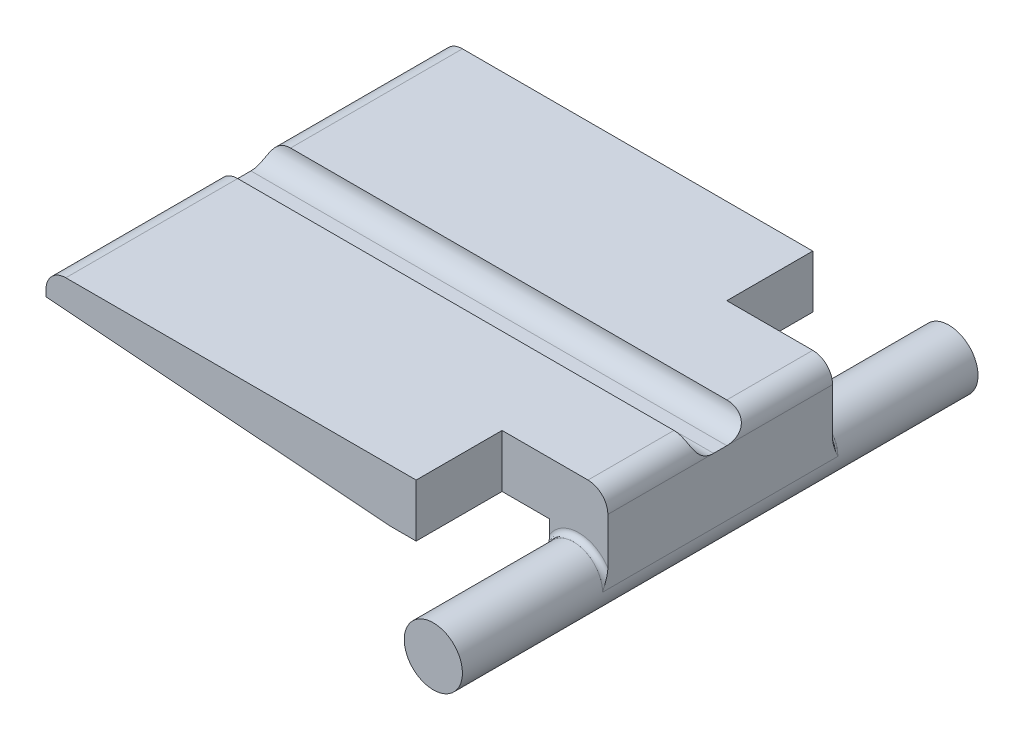
ISO-10303-21;
HEADER;
FILE_DESCRIPTION(('STEP AP214'),'2;1');
FILE_NAME('part.step','',(''),(''),'','','');
FILE_SCHEMA(('AUTOMOTIVE_DESIGN { 1 0 10303 214 1 1 1 1 }'));
ENDSEC;
DATA;
#1=APPLICATION_CONTEXT('core data for automotive mechanical design processes');
#2=APPLICATION_PROTOCOL_DEFINITION('international standard','automotive_design',2000,#1);
#3=PRODUCT_CONTEXT('',#1,'mechanical');
#4=PRODUCT('Part','Part','',(#3));
#5=PRODUCT_RELATED_PRODUCT_CATEGORY('part','',(#4));
#6=PRODUCT_DEFINITION_FORMATION('','',#4);
#7=PRODUCT_DEFINITION_CONTEXT('part definition',#1,'design');
#8=PRODUCT_DEFINITION('design','',#6,#7);
#9=PRODUCT_DEFINITION_SHAPE('','',#8);
#10=(LENGTH_UNIT() NAMED_UNIT(*) SI_UNIT(.MILLI.,.METRE.));
#11=(NAMED_UNIT(*) PLANE_ANGLE_UNIT() SI_UNIT($,.RADIAN.));
#12=(NAMED_UNIT(*) SI_UNIT($,.STERADIAN.) SOLID_ANGLE_UNIT());
#13=UNCERTAINTY_MEASURE_WITH_UNIT(LENGTH_MEASURE(1.E-05),#10,'distance_accuracy_value','');
#14=(GEOMETRIC_REPRESENTATION_CONTEXT(3) GLOBAL_UNCERTAINTY_ASSIGNED_CONTEXT((#13)) GLOBAL_UNIT_ASSIGNED_CONTEXT((#10,
#11,#12)) REPRESENTATION_CONTEXT('',''));
#15=CARTESIAN_POINT('',(0.,0.,0.));
#16=DIRECTION('',(0.,0.,1.));
#17=DIRECTION('',(1.,0.,0.));
#18=AXIS2_PLACEMENT_3D('',#15,#16,#17);
#19=CARTESIAN_POINT('',(0.,2.,0.));
#20=DIRECTION('',(0.,-1.,0.));
#21=DIRECTION('',(0.,0.,-1.));
#22=AXIS2_PLACEMENT_3D('',#19,#20,#21);
#23=PLANE('',#22);
#24=DIRECTION('',(-1.,0.,0.));
#25=VECTOR('',#24,1.);
#26=CARTESIAN_POINT('',(0.,2.,1.));
#27=LINE('',#26,#25);
#28=CARTESIAN_POINT('',(10.25,2.,1.));
#29=VERTEX_POINT('',#28);
#30=CARTESIAN_POINT('',(-6.25,2.,1.));
#31=VERTEX_POINT('',#30);
#32=EDGE_CURVE('E291',#29,#31,#27,.T.);
#33=ORIENTED_EDGE('',*,*,#32,.T.);
#34=DIRECTION('',(0.,0.,1.));
#35=VECTOR('',#34,1.);
#36=CARTESIAN_POINT('',(-6.25,2.,0.));
#37=LINE('',#36,#35);
#38=CARTESIAN_POINT('',(-6.25,2.,7.5));
#39=VERTEX_POINT('',#38);
#40=EDGE_CURVE('E427',#31,#39,#37,.T.);
#41=ORIENTED_EDGE('',*,*,#40,.T.);
#42=DIRECTION('',(1.,0.,0.));
#43=VECTOR('',#42,1.);
#44=CARTESIAN_POINT('',(-7.,2.,7.5));
#45=LINE('',#44,#43);
#46=CARTESIAN_POINT('',(7.,2.,7.5));
#47=VERTEX_POINT('',#46);
#48=EDGE_CURVE('E230',#39,#47,#45,.T.);
#49=ORIENTED_EDGE('',*,*,#48,.T.);
#50=DIRECTION('',(0.,0.,-1.));
#51=VECTOR('',#50,1.);
#52=CARTESIAN_POINT('',(7.,2.,7.5));
#53=LINE('',#52,#51);
#54=CARTESIAN_POINT('',(7.,2.,4.25));
#55=VERTEX_POINT('',#54);
#56=EDGE_CURVE('E233',#47,#55,#53,.T.);
#57=ORIENTED_EDGE('',*,*,#56,.T.);
#58=DIRECTION('',(1.,0.,0.));
#59=VECTOR('',#58,1.);
#60=CARTESIAN_POINT('',(7.,2.,4.25));
#61=LINE('',#60,#59);
#62=CARTESIAN_POINT('',(10.25,2.,4.25));
#63=VERTEX_POINT('',#62);
#64=EDGE_CURVE('E236',#55,#63,#61,.T.);
#65=ORIENTED_EDGE('',*,*,#64,.T.);
#66=DIRECTION('',(0.,0.,-1.));
#67=VECTOR('',#66,1.);
#68=CARTESIAN_POINT('',(10.25,2.,0.));
#69=LINE('',#68,#67);
#70=EDGE_CURVE('E423',#63,#29,#69,.T.);
#71=ORIENTED_EDGE('',*,*,#70,.T.);
#72=EDGE_LOOP('',(#33,#41,#49,#57,#65,#71));
#73=FACE_BOUND('',#72,.T.);
#74=ADVANCED_FACE('F41',(#73),#23,.F.);
#75=CARTESIAN_POINT('',(7.,2.,-4.25));
#76=DIRECTION('',(-1.,0.,0.));
#77=DIRECTION('',(0.,0.,1.));
#78=AXIS2_PLACEMENT_3D('',#75,#76,#77);
#79=PLANE('',#78);
#80=DIRECTION('',(0.,0.,-1.));
#81=VECTOR('',#80,1.);
#82=CARTESIAN_POINT('',(7.,0.,-4.25));
#83=LINE('',#82,#81);
#84=CARTESIAN_POINT('',(7.,0.,-4.25));
#85=VERTEX_POINT('',#84);
#86=CARTESIAN_POINT('',(7.,0.,-7.5));
#87=VERTEX_POINT('',#86);
#88=EDGE_CURVE('E198',#85,#87,#83,.T.);
#89=ORIENTED_EDGE('',*,*,#88,.T.);
#90=DIRECTION('',(0.,-1.,0.));
#91=VECTOR('',#90,1.);
#92=CARTESIAN_POINT('',(7.,2.,-7.5));
#93=LINE('',#92,#91);
#94=CARTESIAN_POINT('',(7.,2.,-7.5));
#95=VERTEX_POINT('',#94);
#96=EDGE_CURVE('E283',#95,#87,#93,.T.);
#97=ORIENTED_EDGE('',*,*,#96,.F.);
#98=DIRECTION('',(0.,0.,-1.));
#99=VECTOR('',#98,1.);
#100=CARTESIAN_POINT('',(7.,2.,-4.25));
#101=LINE('',#100,#99);
#102=CARTESIAN_POINT('',(7.,2.,-4.25));
#103=VERTEX_POINT('',#102);
#104=EDGE_CURVE('E200',#103,#95,#101,.T.);
#105=ORIENTED_EDGE('',*,*,#104,.F.);
#106=DIRECTION('',(0.,-1.,0.));
#107=VECTOR('',#106,1.);
#108=CARTESIAN_POINT('',(7.,2.,-4.25));
#109=LINE('',#108,#107);
#110=EDGE_CURVE('E243',#103,#85,#109,.T.);
#111=ORIENTED_EDGE('',*,*,#110,.T.);
#112=EDGE_LOOP('',(#89,#97,#105,#111));
#113=FACE_BOUND('',#112,.T.);
#114=ADVANCED_FACE('F343',(#113),#79,.F.);
#115=CARTESIAN_POINT('',(-7.,2.,-7.5));
#116=DIRECTION('',(0.,0.,1.));
#117=DIRECTION('',(1.,0.,0.));
#118=AXIS2_PLACEMENT_3D('',#115,#116,#117);
#119=PLANE('',#118);
#120=DIRECTION('',(-1.,0.,0.));
#121=VECTOR('',#120,1.);
#122=CARTESIAN_POINT('',(-7.,0.,-7.5));
#123=LINE('',#122,#121);
#124=CARTESIAN_POINT('',(6.00000000000059,0.,-7.5));
#125=VERTEX_POINT('',#124);
#126=EDGE_CURVE('E246',#87,#125,#123,.T.);
#127=ORIENTED_EDGE('',*,*,#126,.T.);
#128=DIRECTION('',(-0.997054485501582,0.0766964988847336,0.));
#129=VECTOR('',#128,1.);
#130=CARTESIAN_POINT('',(-7.,1.,-7.5));
#131=LINE('',#130,#129);
#132=CARTESIAN_POINT('',(-7.,1.,-7.5));
#133=VERTEX_POINT('',#132);
#134=EDGE_CURVE('E465',#125,#133,#131,.T.);
#135=ORIENTED_EDGE('',*,*,#134,.T.);
#136=DIRECTION('',(0.,-1.,0.));
#137=VECTOR('',#136,1.);
#138=CARTESIAN_POINT('',(-7.,2.,-7.5));
#139=LINE('',#138,#137);
#140=CARTESIAN_POINT('',(-7.,1.25,-7.5));
#141=VERTEX_POINT('',#140);
#142=EDGE_CURVE('E279',#141,#133,#139,.T.);
#143=ORIENTED_EDGE('',*,*,#142,.F.);
#144=CARTESIAN_POINT('',(-6.25,1.25,-7.5));
#145=DIRECTION('',(0.,0.,1.));
#146=DIRECTION('',(1.,0.,0.));
#147=AXIS2_PLACEMENT_3D('',#144,#145,#146);
#148=CIRCLE('',#147,0.75);
#149=CARTESIAN_POINT('',(-6.25,2.,-7.5));
#150=VERTEX_POINT('',#149);
#151=EDGE_CURVE('E408',#141,#150,#148,.F.);
#152=ORIENTED_EDGE('',*,*,#151,.T.);
#153=DIRECTION('',(-1.,0.,0.));
#154=VECTOR('',#153,1.);
#155=CARTESIAN_POINT('',(-7.,2.,-7.5));
#156=LINE('',#155,#154);
#157=EDGE_CURVE('E226',#95,#150,#156,.T.);
#158=ORIENTED_EDGE('',*,*,#157,.F.);
#159=ORIENTED_EDGE('',*,*,#96,.T.);
#160=EDGE_LOOP('',(#127,#135,#143,#152,#158,#159));
#161=FACE_BOUND('',#160,.T.);
#162=ADVANCED_FACE('F388',(#161),#119,.F.);
#163=CARTESIAN_POINT('',(-7.,2.,7.5));
#164=DIRECTION('',(1.,0.,0.));
#165=DIRECTION('',(0.,0.,-1.));
#166=AXIS2_PLACEMENT_3D('',#163,#164,#165);
#167=PLANE('',#166);
#168=ORIENTED_EDGE('',*,*,#142,.T.);
#169=DIRECTION('',(0.,0.,1.));
#170=VECTOR('',#169,1.);
#171=CARTESIAN_POINT('',(-7.,1.,7.5));
#172=LINE('',#171,#170);
#173=CARTESIAN_POINT('',(-7.,1.,7.5));
#174=VERTEX_POINT('',#173);
#175=EDGE_CURVE('E455',#133,#174,#172,.T.);
#176=ORIENTED_EDGE('',*,*,#175,.T.);
#177=DIRECTION('',(0.,-1.,0.));
#178=VECTOR('',#177,1.);
#179=CARTESIAN_POINT('',(-7.,2.,7.5));
#180=LINE('',#179,#178);
#181=CARTESIAN_POINT('',(-7.,1.25,7.5));
#182=VERTEX_POINT('',#181);
#183=EDGE_CURVE('E275',#182,#174,#180,.T.);
#184=ORIENTED_EDGE('',*,*,#183,.F.);
#185=DIRECTION('',(0.,0.,1.));
#186=VECTOR('',#185,1.);
#187=CARTESIAN_POINT('',(-7.,1.25,7.5));
#188=LINE('',#187,#186);
#189=CARTESIAN_POINT('',(-7.,1.25,0.25));
#190=VERTEX_POINT('',#189);
#191=EDGE_CURVE('E412',#182,#190,#188,.F.);
#192=ORIENTED_EDGE('',*,*,#191,.T.);
#193=DIRECTION('',(0.,0.,1.));
#194=VECTOR('',#193,1.);
#195=CARTESIAN_POINT('',(-7.,1.25,7.5));
#196=LINE('',#195,#194);
#197=CARTESIAN_POINT('',(-7.,1.25,-0.25));
#198=VERTEX_POINT('',#197);
#199=EDGE_CURVE('E219',#198,#190,#196,.T.);
#200=ORIENTED_EDGE('',*,*,#199,.F.);
#201=DIRECTION('',(0.,0.,1.));
#202=VECTOR('',#201,1.);
#203=CARTESIAN_POINT('',(-7.,1.25,7.5));
#204=LINE('',#203,#202);
#205=EDGE_CURVE('E409',#198,#141,#204,.F.);
#206=ORIENTED_EDGE('',*,*,#205,.T.);
#207=EDGE_LOOP('',(#168,#176,#184,#192,#200,#206));
#208=FACE_BOUND('',#207,.T.);
#209=ADVANCED_FACE('F576',(#208),#167,.F.);
#210=CARTESIAN_POINT('',(-7.,2.,7.5));
#211=DIRECTION('',(0.,0.,-1.));
#212=DIRECTION('',(-1.,0.,0.));
#213=AXIS2_PLACEMENT_3D('',#210,#211,#212);
#214=PLANE('',#213);
#215=ORIENTED_EDGE('',*,*,#183,.T.);
#216=DIRECTION('',(0.997054485501582,-0.0766964988847336,0.));
#217=VECTOR('',#216,1.);
#218=CARTESIAN_POINT('',(-7.,1.,7.5));
#219=LINE('',#218,#217);
#220=CARTESIAN_POINT('',(6.00000000000059,0.,7.5));
#221=VERTEX_POINT('',#220);
#222=EDGE_CURVE('E459',#174,#221,#219,.T.);
#223=ORIENTED_EDGE('',*,*,#222,.T.);
#224=DIRECTION('',(1.,0.,0.));
#225=VECTOR('',#224,1.);
#226=CARTESIAN_POINT('',(-7.,0.,7.5));
#227=LINE('',#226,#225);
#228=CARTESIAN_POINT('',(7.,0.,7.5));
#229=VERTEX_POINT('',#228);
#230=EDGE_CURVE('E250',#221,#229,#227,.T.);
#231=ORIENTED_EDGE('',*,*,#230,.T.);
#232=DIRECTION('',(0.,-1.,0.));
#233=VECTOR('',#232,1.);
#234=CARTESIAN_POINT('',(7.,2.,7.5));
#235=LINE('',#234,#233);
#236=EDGE_CURVE('E271',#47,#229,#235,.T.);
#237=ORIENTED_EDGE('',*,*,#236,.F.);
#238=ORIENTED_EDGE('',*,*,#48,.F.);
#239=CARTESIAN_POINT('',(-6.25,1.25,7.5));
#240=DIRECTION('',(0.,0.,-1.));
#241=DIRECTION('',(-1.,0.,0.));
#242=AXIS2_PLACEMENT_3D('',#239,#240,#241);
#243=CIRCLE('',#242,0.75);
#244=EDGE_CURVE('E430',#39,#182,#243,.F.);
#245=ORIENTED_EDGE('',*,*,#244,.T.);
#246=EDGE_LOOP('',(#215,#223,#231,#237,#238,#245));
#247=FACE_BOUND('',#246,.T.);
#248=ADVANCED_FACE('F585',(#247),#214,.F.);
#249=CARTESIAN_POINT('',(7.,2.,7.5));
#250=DIRECTION('',(-1.,0.,0.));
#251=DIRECTION('',(0.,0.,1.));
#252=AXIS2_PLACEMENT_3D('',#249,#250,#251);
#253=PLANE('',#252);
#254=DIRECTION('',(0.,0.,-1.));
#255=VECTOR('',#254,1.);
#256=CARTESIAN_POINT('',(7.,0.,7.5));
#257=LINE('',#256,#255);
#258=CARTESIAN_POINT('',(7.,0.,4.25));
#259=VERTEX_POINT('',#258);
#260=EDGE_CURVE('E253',#229,#259,#257,.T.);
#261=ORIENTED_EDGE('',*,*,#260,.T.);
#262=DIRECTION('',(0.,-1.,0.));
#263=VECTOR('',#262,1.);
#264=CARTESIAN_POINT('',(7.,2.,4.25));
#265=LINE('',#264,#263);
#266=EDGE_CURVE('E267',#55,#259,#265,.T.);
#267=ORIENTED_EDGE('',*,*,#266,.F.);
#268=ORIENTED_EDGE('',*,*,#56,.F.);
#269=ORIENTED_EDGE('',*,*,#236,.T.);
#270=EDGE_LOOP('',(#261,#267,#268,#269));
#271=FACE_BOUND('',#270,.T.);
#272=ADVANCED_FACE('F593',(#271),#253,.F.);
#273=CARTESIAN_POINT('',(7.,2.,4.25));
#274=DIRECTION('',(0.,0.,-1.));
#275=DIRECTION('',(-1.,0.,0.));
#276=AXIS2_PLACEMENT_3D('',#273,#274,#275);
#277=PLANE('',#276);
#278=DIRECTION('',(0.,1.,0.));
#279=VECTOR('',#278,1.);
#280=CARTESIAN_POINT('',(8.8,-1.2,4.25));
#281=LINE('',#280,#279);
#282=CARTESIAN_POINT('',(8.8,-0.507179676972445,4.25));
#283=VERTEX_POINT('',#282);
#284=CARTESIAN_POINT('',(8.8,0.,4.25));
#285=VERTEX_POINT('',#284);
#286=EDGE_CURVE('E186',#283,#285,#281,.T.);
#287=ORIENTED_EDGE('',*,*,#286,.F.);
#288=CARTESIAN_POINT('',(9.9,-1.2,4.25));
#289=DIRECTION('',(0.,0.,-1.));
#290=DIRECTION('',(-1.,0.,0.));
#291=AXIS2_PLACEMENT_3D('',#288,#289,#290);
#292=CIRCLE('',#291,1.3);
#293=CARTESIAN_POINT('',(11.,-0.507179676972447,4.25));
#294=VERTEX_POINT('',#293);
#295=EDGE_CURVE('E476',#283,#294,#292,.T.);
#296=ORIENTED_EDGE('',*,*,#295,.T.);
#297=DIRECTION('',(0.,-1.,0.));
#298=VECTOR('',#297,1.);
#299=CARTESIAN_POINT('',(11.,2.,4.25));
#300=LINE('',#299,#298);
#301=CARTESIAN_POINT('',(11.,1.25,4.25));
#302=VERTEX_POINT('',#301);
#303=EDGE_CURVE('E263',#302,#294,#300,.T.);
#304=ORIENTED_EDGE('',*,*,#303,.F.);
#305=CARTESIAN_POINT('',(10.25,1.25,4.25));
#306=DIRECTION('',(0.,0.,-1.));
#307=DIRECTION('',(-1.,0.,0.));
#308=AXIS2_PLACEMENT_3D('',#305,#306,#307);
#309=CIRCLE('',#308,0.75);
#310=EDGE_CURVE('E447',#302,#63,#309,.F.);
#311=ORIENTED_EDGE('',*,*,#310,.T.);
#312=ORIENTED_EDGE('',*,*,#64,.F.);
#313=ORIENTED_EDGE('',*,*,#266,.T.);
#314=DIRECTION('',(1.,0.,0.));
#315=VECTOR('',#314,1.);
#316=CARTESIAN_POINT('',(7.,0.,4.25));
#317=LINE('',#316,#315);
#318=EDGE_CURVE('E201',#259,#285,#317,.T.);
#319=ORIENTED_EDGE('',*,*,#318,.T.);
#320=EDGE_LOOP('',(#287,#296,#304,#311,#312,#313,#319));
#321=FACE_BOUND('',#320,.T.);
#322=ADVANCED_FACE('F615',(#321),#277,.F.);
#323=CARTESIAN_POINT('',(11.,2.,-4.25));
#324=DIRECTION('',(-1.,0.,0.));
#325=DIRECTION('',(0.,0.,1.));
#326=AXIS2_PLACEMENT_3D('',#323,#324,#325);
#327=PLANE('',#326);
#328=DIRECTION('',(0.,-1.,0.));
#329=VECTOR('',#328,1.);
#330=CARTESIAN_POINT('',(11.,2.,-4.25));
#331=LINE('',#330,#329);
#332=CARTESIAN_POINT('',(11.,1.25,-4.25));
#333=VERTEX_POINT('',#332);
#334=CARTESIAN_POINT('',(11.,-0.507179676972447,-4.25));
#335=VERTEX_POINT('',#334);
#336=EDGE_CURVE('E260',#333,#335,#331,.T.);
#337=ORIENTED_EDGE('',*,*,#336,.F.);
#338=DIRECTION('',(0.,0.,-1.));
#339=VECTOR('',#338,1.);
#340=CARTESIAN_POINT('',(11.,1.25,-4.25));
#341=LINE('',#340,#339);
#342=CARTESIAN_POINT('',(11.,1.25,-0.25));
#343=VERTEX_POINT('',#342);
#344=EDGE_CURVE('E445',#333,#343,#341,.F.);
#345=ORIENTED_EDGE('',*,*,#344,.T.);
#346=DIRECTION('',(0.,0.,-1.));
#347=VECTOR('',#346,1.);
#348=CARTESIAN_POINT('',(11.,1.25,-4.25));
#349=LINE('',#348,#347);
#350=CARTESIAN_POINT('',(11.,1.25,0.25));
#351=VERTEX_POINT('',#350);
#352=EDGE_CURVE('E295',#351,#343,#349,.T.);
#353=ORIENTED_EDGE('',*,*,#352,.F.);
#354=DIRECTION('',(0.,0.,-1.));
#355=VECTOR('',#354,1.);
#356=CARTESIAN_POINT('',(11.,1.25,-4.25));
#357=LINE('',#356,#355);
#358=EDGE_CURVE('E442',#351,#302,#357,.F.);
#359=ORIENTED_EDGE('',*,*,#358,.T.);
#360=ORIENTED_EDGE('',*,*,#303,.T.);
#361=CARTESIAN_POINT('',(11.,-0.507179676972447,4.25));
#362=CARTESIAN_POINT('',(11.,-0.533570108237444,4.25002609518782));
#363=CARTESIAN_POINT('',(11.,-0.559907792336211,4.25147979549435));
#364=CARTESIAN_POINT('',(11.,-0.612280881824183,4.25671892288793));
#365=CARTESIAN_POINT('',(11.,-0.638316940483388,4.26049760445141));
#366=CARTESIAN_POINT('',(11.,-0.689780706815921,4.26982166006505));
#367=CARTESIAN_POINT('',(11.,-0.715211908742209,4.2753486712416));
#368=CARTESIAN_POINT('',(11.,-0.765741006431748,4.28782512540721));
#369=CARTESIAN_POINT('',(11.,-0.790838612006734,4.29477573023453));
#370=CARTESIAN_POINT('',(11.,-0.880349392736877,4.32170591053305));
#371=CARTESIAN_POINT('',(11.,-0.943800664436202,4.3448242567609));
#372=CARTESIAN_POINT('',(11.,-1.06947524176188,4.39440499310617));
#373=CARTESIAN_POINT('',(11.,-1.13169467558704,4.42087643518738));
#374=CARTESIAN_POINT('',(11.,-1.19593219182129,4.44826548504607));
#375=CARTESIAN_POINT('',(11.,-1.19796609233935,4.44913274348481));
#376=CARTESIAN_POINT('',(11.,-1.2,4.45));
#377=B_SPLINE_CURVE_WITH_KNOTS('',3,(#361,#362,#363,#364,#365,#366,#367,#368,#369,#370,#371,
#372,#373,#374,#375,#376),.UNSPECIFIED.,.F.,.F.,(4,2,2,2,2,2,2,4),(0.,0.0790590726060173,
0.157889843827805,0.235918701450409,0.314011496391406,0.516318876941776,0.719184532080729,
0.725817781661669),.UNSPECIFIED.);
#378=CARTESIAN_POINT('',(11.,-1.2,4.45));
#379=VERTEX_POINT('',#378);
#380=EDGE_CURVE('E488',#294,#379,#377,.T.);
#381=ORIENTED_EDGE('',*,*,#380,.T.);
#382=DIRECTION('',(0.,0.,1.));
#383=VECTOR('',#382,1.);
#384=CARTESIAN_POINT('',(11.,-1.2,4.25));
#385=LINE('',#384,#383);
#386=CARTESIAN_POINT('',(11.,-1.2,-4.45));
#387=VERTEX_POINT('',#386);
#388=EDGE_CURVE('E206',#387,#379,#385,.T.);
#389=ORIENTED_EDGE('',*,*,#388,.F.);
#390=CARTESIAN_POINT('',(11.,-0.507179676972447,-4.25));
#391=CARTESIAN_POINT('',(11.,-0.533570108237444,-4.25002609518781));
#392=CARTESIAN_POINT('',(11.,-0.559907792336212,-4.25147979549435));
#393=CARTESIAN_POINT('',(11.,-0.612280881824184,-4.25671892288793));
#394=CARTESIAN_POINT('',(11.,-0.63831694048339,-4.26049760445141));
#395=CARTESIAN_POINT('',(11.,-0.689780706815922,-4.26982166006505));
#396=CARTESIAN_POINT('',(11.,-0.71521190874221,-4.2753486712416));
#397=CARTESIAN_POINT('',(11.,-0.765741006431749,-4.28782512540721));
#398=CARTESIAN_POINT('',(11.,-0.790838612006735,-4.29477573023453));
#399=CARTESIAN_POINT('',(11.,-0.880349392736878,-4.32170591053305));
#400=CARTESIAN_POINT('',(11.,-0.943800664436203,-4.3448242567609));
#401=CARTESIAN_POINT('',(11.,-1.06947524176188,-4.39440499310617));
#402=CARTESIAN_POINT('',(11.,-1.13169467558704,-4.42087643518739));
#403=CARTESIAN_POINT('',(11.,-1.19593219182129,-4.44826548504607));
#404=CARTESIAN_POINT('',(11.,-1.19796609233935,-4.44913274348481));
#405=CARTESIAN_POINT('',(11.,-1.2,-4.45));
#406=B_SPLINE_CURVE_WITH_KNOTS('',3,(#390,#391,#392,#393,#394,#395,#396,#397,#398,#399,#400,
#401,#402,#403,#404,#405),.UNSPECIFIED.,.F.,.F.,(4,2,2,2,2,2,2,4),(0.,0.0790590726060181,
0.157889843827807,0.23591870145041,0.314011496391406,0.516318876941775,0.719184532080729,
0.725817781661668),.UNSPECIFIED.);
#407=EDGE_CURVE('E56',#387,#335,#406,.F.);
#408=ORIENTED_EDGE('',*,*,#407,.T.);
#409=EDGE_LOOP('',(#337,#345,#353,#359,#360,#381,#389,#408));
#410=FACE_BOUND('',#409,.T.);
#411=ADVANCED_FACE('F399',(#410),#327,.F.);
#412=CARTESIAN_POINT('',(7.,2.,-4.25));
#413=DIRECTION('',(0.,0.,1.));
#414=DIRECTION('',(1.,0.,0.));
#415=AXIS2_PLACEMENT_3D('',#412,#413,#414);
#416=PLANE('',#415);
#417=ORIENTED_EDGE('',*,*,#336,.T.);
#418=CARTESIAN_POINT('',(9.9,-1.2,-4.25));
#419=DIRECTION('',(0.,0.,1.));
#420=DIRECTION('',(1.,0.,0.));
#421=AXIS2_PLACEMENT_3D('',#418,#419,#420);
#422=CIRCLE('',#421,1.3);
#423=CARTESIAN_POINT('',(8.8,-0.507179676972445,-4.25));
#424=VERTEX_POINT('',#423);
#425=EDGE_CURVE('E63',#335,#424,#422,.T.);
#426=ORIENTED_EDGE('',*,*,#425,.T.);
#427=DIRECTION('',(0.,1.,0.));
#428=VECTOR('',#427,1.);
#429=CARTESIAN_POINT('',(8.8,-1.2,-4.25));
#430=LINE('',#429,#428);
#431=CARTESIAN_POINT('',(8.8,0.,-4.25));
#432=VERTEX_POINT('',#431);
#433=EDGE_CURVE('E176',#424,#432,#430,.T.);
#434=ORIENTED_EDGE('',*,*,#433,.T.);
#435=DIRECTION('',(-1.,0.,0.));
#436=VECTOR('',#435,1.);
#437=CARTESIAN_POINT('',(7.,0.,-4.25));
#438=LINE('',#437,#436);
#439=EDGE_CURVE('E180',#432,#85,#438,.T.);
#440=ORIENTED_EDGE('',*,*,#439,.T.);
#441=ORIENTED_EDGE('',*,*,#110,.F.);
#442=DIRECTION('',(-1.,0.,0.));
#443=VECTOR('',#442,1.);
#444=CARTESIAN_POINT('',(7.,2.,-4.25));
#445=LINE('',#444,#443);
#446=CARTESIAN_POINT('',(10.25,2.,-4.25));
#447=VERTEX_POINT('',#446);
#448=EDGE_CURVE('E240',#447,#103,#445,.T.);
#449=ORIENTED_EDGE('',*,*,#448,.F.);
#450=CARTESIAN_POINT('',(10.25,1.25,-4.25));
#451=DIRECTION('',(0.,0.,1.));
#452=DIRECTION('',(1.,0.,0.));
#453=AXIS2_PLACEMENT_3D('',#450,#451,#452);
#454=CIRCLE('',#453,0.75);
#455=EDGE_CURVE('E367',#447,#333,#454,.F.);
#456=ORIENTED_EDGE('',*,*,#455,.T.);
#457=EDGE_LOOP('',(#417,#426,#434,#440,#441,#449,#456));
#458=FACE_BOUND('',#457,.T.);
#459=ADVANCED_FACE('F178',(#458),#416,.F.);
#460=ORIENTED_EDGE('',*,*,#157,.T.);
#461=DIRECTION('',(0.,0.,1.));
#462=VECTOR('',#461,1.);
#463=CARTESIAN_POINT('',(-6.25,2.,0.));
#464=LINE('',#463,#462);
#465=CARTESIAN_POINT('',(-6.25,2.,-1.));
#466=VERTEX_POINT('',#465);
#467=EDGE_CURVE('E311',#150,#466,#464,.T.);
#468=ORIENTED_EDGE('',*,*,#467,.T.);
#469=DIRECTION('',(1.,0.,0.));
#470=VECTOR('',#469,1.);
#471=CARTESIAN_POINT('',(0.,2.,-1.));
#472=LINE('',#471,#470);
#473=CARTESIAN_POINT('',(10.25,2.,-1.));
#474=VERTEX_POINT('',#473);
#475=EDGE_CURVE('E287',#466,#474,#472,.T.);
#476=ORIENTED_EDGE('',*,*,#475,.T.);
#477=DIRECTION('',(0.,0.,-1.));
#478=VECTOR('',#477,1.);
#479=CARTESIAN_POINT('',(10.25,2.,0.));
#480=LINE('',#479,#478);
#481=EDGE_CURVE('E307',#474,#447,#480,.T.);
#482=ORIENTED_EDGE('',*,*,#481,.T.);
#483=ORIENTED_EDGE('',*,*,#448,.T.);
#484=ORIENTED_EDGE('',*,*,#104,.T.);
#485=EDGE_LOOP('',(#460,#468,#476,#482,#483,#484));
#486=FACE_BOUND('',#485,.T.);
#487=ADVANCED_FACE('F384',(#486),#23,.F.);
#488=CARTESIAN_POINT('',(0.,0.,0.));
#489=DIRECTION('',(0.,-1.,0.));
#490=DIRECTION('',(0.,0.,-1.));
#491=AXIS2_PLACEMENT_3D('',#488,#489,#490);
#492=PLANE('',#491);
#493=ORIENTED_EDGE('',*,*,#230,.F.);
#494=DIRECTION('',(0.,0.,-1.));
#495=VECTOR('',#494,1.);
#496=CARTESIAN_POINT('',(6.00000000000059,0.,-7.5));
#497=LINE('',#496,#495);
#498=EDGE_CURVE('E462',#221,#125,#497,.T.);
#499=ORIENTED_EDGE('',*,*,#498,.T.);
#500=ORIENTED_EDGE('',*,*,#126,.F.);
#501=ORIENTED_EDGE('',*,*,#88,.F.);
#502=ORIENTED_EDGE('',*,*,#439,.F.);
#503=DIRECTION('',(0.,0.,-1.));
#504=VECTOR('',#503,1.);
#505=CARTESIAN_POINT('',(8.8,0.,4.25));
#506=LINE('',#505,#504);
#507=EDGE_CURVE('E195',#285,#432,#506,.T.);
#508=ORIENTED_EDGE('',*,*,#507,.F.);
#509=ORIENTED_EDGE('',*,*,#318,.F.);
#510=ORIENTED_EDGE('',*,*,#260,.F.);
#511=EDGE_LOOP('',(#493,#499,#500,#501,#502,#508,#509,#510));
#512=FACE_BOUND('',#511,.T.);
#513=ADVANCED_FACE('F193',(#512),#492,.T.);
#514=CARTESIAN_POINT('',(0.,1.25,0.));
#515=DIRECTION('',(0.,1.,0.));
#516=DIRECTION('',(0.,0.,1.));
#517=AXIS2_PLACEMENT_3D('',#514,#515,#516);
#518=PLANE('',#517);
#519=ORIENTED_EDGE('',*,*,#352,.T.);
#520=DIRECTION('',(-1.,0.,0.));
#521=VECTOR('',#520,1.);
#522=CARTESIAN_POINT('',(0.,1.25,-0.25));
#523=LINE('',#522,#521);
#524=EDGE_CURVE('E303',#343,#198,#523,.T.);
#525=ORIENTED_EDGE('',*,*,#524,.T.);
#526=ORIENTED_EDGE('',*,*,#199,.T.);
#527=DIRECTION('',(1.,0.,0.));
#528=VECTOR('',#527,1.);
#529=CARTESIAN_POINT('',(0.,1.25,0.25));
#530=LINE('',#529,#528);
#531=EDGE_CURVE('E299',#190,#351,#530,.T.);
#532=ORIENTED_EDGE('',*,*,#531,.T.);
#533=EDGE_LOOP('',(#519,#525,#526,#532));
#534=FACE_BOUND('',#533,.T.);
#535=ADVANCED_FACE('F398',(#534),#518,.T.);
#536=CARTESIAN_POINT('',(8.8,-1.2,4.25));
#537=DIRECTION('',(1.,0.,0.));
#538=DIRECTION('',(0.,0.,-1.));
#539=AXIS2_PLACEMENT_3D('',#536,#537,#538);
#540=PLANE('',#539);
#541=ORIENTED_EDGE('',*,*,#507,.T.);
#542=ORIENTED_EDGE('',*,*,#433,.F.);
#543=CARTESIAN_POINT('',(8.8,-0.507179676972445,-4.25));
#544=CARTESIAN_POINT('',(8.8,-0.53357010823748,-4.25002609518781));
#545=CARTESIAN_POINT('',(8.8,-0.559907792336285,-4.25147979549436));
#546=CARTESIAN_POINT('',(8.8,-0.612280881824323,-4.25671892288795));
#547=CARTESIAN_POINT('',(8.8,-0.638316940483557,-4.26049760445144));
#548=CARTESIAN_POINT('',(8.8,-0.689780706816082,-4.26982166006508));
#549=CARTESIAN_POINT('',(8.8,-0.715211908742335,-4.27534867124162));
#550=CARTESIAN_POINT('',(8.8,-0.765741006431802,-4.28782512540723));
#551=CARTESIAN_POINT('',(8.8,-0.79083861200675,-4.29477573023456));
#552=CARTESIAN_POINT('',(8.8,-0.880349392736879,-4.32170591053299));
#553=CARTESIAN_POINT('',(8.8,-0.943800664436309,-4.34482425676057));
#554=CARTESIAN_POINT('',(8.80000000000001,-1.06947524176171,-4.39440499310649));
#555=CARTESIAN_POINT('',(8.80000000000002,-1.13169467558649,-4.42087643518865));
#556=CARTESIAN_POINT('',(8.8,-1.19593219182126,-4.44826548504616));
#557=CARTESIAN_POINT('',(8.8,-1.19796609233933,-4.44913274348485));
#558=CARTESIAN_POINT('',(8.8,-1.2,-4.45));
#559=B_SPLINE_CURVE_WITH_KNOTS('',3,(#543,#544,#545,#546,#547,#548,#549,#550,#551,#552,#553,
#554,#555,#556,#557,#558),.UNSPECIFIED.,.F.,.F.,(4,2,2,2,2,2,2,4),(0.,0.0790590726061314,
0.157889843828008,0.235918701450502,0.3140114963914,0.516318876941731,0.719184532080732,
0.72581778166167),.UNSPECIFIED.);
#560=CARTESIAN_POINT('',(8.8,-1.2,-4.45));
#561=VERTEX_POINT('',#560);
#562=EDGE_CURVE('E11',#424,#561,#559,.T.);
#563=ORIENTED_EDGE('',*,*,#562,.T.);
#564=DIRECTION('',(0.,0.,-1.));
#565=VECTOR('',#564,1.);
#566=CARTESIAN_POINT('',(8.8,-1.2,4.25));
#567=LINE('',#566,#565);
#568=CARTESIAN_POINT('',(8.8,-1.2,4.45));
#569=VERTEX_POINT('',#568);
#570=EDGE_CURVE('E187',#569,#561,#567,.T.);
#571=ORIENTED_EDGE('',*,*,#570,.F.);
#572=CARTESIAN_POINT('',(8.8,-0.507179676972445,4.25));
#573=CARTESIAN_POINT('',(8.8,-0.53357010823748,4.25002609518781));
#574=CARTESIAN_POINT('',(8.8,-0.559907792336285,4.25147979549436));
#575=CARTESIAN_POINT('',(8.8,-0.612280881824323,4.25671892288795));
#576=CARTESIAN_POINT('',(8.8,-0.638316940483557,4.26049760445144));
#577=CARTESIAN_POINT('',(8.8,-0.689780706816082,4.26982166006508));
#578=CARTESIAN_POINT('',(8.8,-0.715211908742335,4.27534867124162));
#579=CARTESIAN_POINT('',(8.8,-0.765741006431802,4.28782512540723));
#580=CARTESIAN_POINT('',(8.8,-0.79083861200675,4.29477573023456));
#581=CARTESIAN_POINT('',(8.8,-0.880349392736879,4.32170591053299));
#582=CARTESIAN_POINT('',(8.8,-0.943800664436309,4.34482425676057));
#583=CARTESIAN_POINT('',(8.80000000000001,-1.06947524176171,4.39440499310649));
#584=CARTESIAN_POINT('',(8.80000000000002,-1.13169467558649,4.42087643518865));
#585=CARTESIAN_POINT('',(8.8,-1.19593219182126,4.44826548504616));
#586=CARTESIAN_POINT('',(8.8,-1.19796609233933,4.44913274348485));
#587=CARTESIAN_POINT('',(8.8,-1.2,4.45));
#588=B_SPLINE_CURVE_WITH_KNOTS('',3,(#572,#573,#574,#575,#576,#577,#578,#579,#580,#581,#582,
#583,#584,#585,#586,#587),.UNSPECIFIED.,.F.,.F.,(4,2,2,2,2,2,2,4),(0.,0.0790590726061316,
0.157889843828008,0.235918701450502,0.314011496391401,0.516318876941731,0.719184532080732,
0.725817781661669),.UNSPECIFIED.);
#589=EDGE_CURVE('E481',#569,#283,#588,.F.);
#590=ORIENTED_EDGE('',*,*,#589,.T.);
#591=ORIENTED_EDGE('',*,*,#286,.T.);
#592=EDGE_LOOP('',(#541,#542,#563,#571,#590,#591));
#593=FACE_BOUND('',#592,.T.);
#594=ADVANCED_FACE('F203',(#593),#540,.F.);
#595=CARTESIAN_POINT('',(9.9,-1.2,9.75));
#596=DIRECTION('',(0.,0.,-1.));
#597=DIRECTION('',(-1.,0.,0.));
#598=AXIS2_PLACEMENT_3D('',#595,#596,#597);
#599=CYLINDRICAL_SURFACE('',#598,1.1);
#600=CARTESIAN_POINT('',(9.9,-1.2,9.75));
#601=DIRECTION('',(0.,0.,1.));
#602=DIRECTION('',(1.,0.,0.));
#603=AXIS2_PLACEMENT_3D('',#600,#601,#602);
#604=CIRCLE('',#603,1.1);
#605=CARTESIAN_POINT('',(11.,-1.2,9.75));
#606=VERTEX_POINT('',#605);
#607=EDGE_CURVE('E207',#606,#606,#604,.T.);
#608=ORIENTED_EDGE('',*,*,#607,.F.);
#609=EDGE_LOOP('',(#608));
#610=FACE_BOUND('',#609,.T.);
#611=CARTESIAN_POINT('',(9.9,-1.2,-9.75));
#612=DIRECTION('',(0.,0.,1.));
#613=DIRECTION('',(1.,0.,0.));
#614=AXIS2_PLACEMENT_3D('',#611,#612,#613);
#615=CIRCLE('',#614,1.1);
#616=CARTESIAN_POINT('',(11.,-1.2,-9.75));
#617=VERTEX_POINT('',#616);
#618=EDGE_CURVE('E213',#617,#617,#615,.T.);
#619=ORIENTED_EDGE('',*,*,#618,.T.);
#620=EDGE_LOOP('',(#619));
#621=FACE_BOUND('',#620,.T.);
#622=CARTESIAN_POINT('',(9.9,-1.2,4.45));
#623=DIRECTION('',(0.,0.,-1.));
#624=DIRECTION('',(-1.,0.,0.));
#625=AXIS2_PLACEMENT_3D('',#622,#623,#624);
#626=CIRCLE('',#625,1.1);
#627=EDGE_CURVE('E472',#379,#569,#626,.F.);
#628=ORIENTED_EDGE('',*,*,#627,.T.);
#629=ORIENTED_EDGE('',*,*,#570,.T.);
#630=CARTESIAN_POINT('',(9.9,-1.2,-4.45));
#631=DIRECTION('',(0.,0.,1.));
#632=DIRECTION('',(1.,0.,0.));
#633=AXIS2_PLACEMENT_3D('',#630,#631,#632);
#634=CIRCLE('',#633,1.1);
#635=EDGE_CURVE('E468',#561,#387,#634,.F.);
#636=ORIENTED_EDGE('',*,*,#635,.T.);
#637=ORIENTED_EDGE('',*,*,#388,.T.);
#638=EDGE_LOOP('',(#628,#629,#636,#637));
#639=FACE_BOUND('',#638,.T.);
#640=ADVANCED_FACE('F500',(#610,#621,#639),#599,.T.);
#641=CARTESIAN_POINT('',(9.9,-1.2,9.75));
#642=DIRECTION('',(0.,0.,1.));
#643=DIRECTION('',(1.,0.,0.));
#644=AXIS2_PLACEMENT_3D('',#641,#642,#643);
#645=PLANE('',#644);
#646=ORIENTED_EDGE('',*,*,#607,.T.);
#647=EDGE_LOOP('',(#646));
#648=FACE_BOUND('',#647,.T.);
#649=ADVANCED_FACE('F520',(#648),#645,.T.);
#650=CARTESIAN_POINT('',(9.9,-1.2,-9.75));
#651=DIRECTION('',(0.,0.,1.));
#652=DIRECTION('',(1.,0.,0.));
#653=AXIS2_PLACEMENT_3D('',#650,#651,#652);
#654=PLANE('',#653);
#655=ORIENTED_EDGE('',*,*,#618,.F.);
#656=EDGE_LOOP('',(#655));
#657=FACE_BOUND('',#656,.T.);
#658=ADVANCED_FACE('F341',(#657),#654,.F.);
#659=CARTESIAN_POINT('',(0.,2.,-0.25));
#660=DIRECTION('',(-1.,0.,0.));
#661=DIRECTION('',(0.,0.,1.));
#662=AXIS2_PLACEMENT_3D('',#659,#660,#661);
#663=CYLINDRICAL_SURFACE('',#662,0.75);
#664=ORIENTED_EDGE('',*,*,#475,.F.);
#665=CARTESIAN_POINT('',(-6.25,2.,-1.));
#666=CARTESIAN_POINT('',(-6.27088462676056,1.99999982347039,-0.999995088268603));
#667=CARTESIAN_POINT('',(-6.29175930339416,1.99912711566255,-1.00000055986188));
#668=CARTESIAN_POINT('',(-6.33336316256166,1.9956452310536,-0.999990330959203));
#669=CARTESIAN_POINT('',(-6.35409234598059,1.99303606482444,-0.99997463059214));
#670=CARTESIAN_POINT('',(-6.4159094231884,1.98261071964646,-0.999832782605627));
#671=CARTESIAN_POINT('',(-6.4565901297775,1.97219672174326,-0.999611750838813));
#672=CARTESIAN_POINT('',(-6.53565917286015,1.94473328021168,-0.998086273370295));
#673=CARTESIAN_POINT('',(-6.57404504722142,1.92767685221967,-0.996780685640039));
#674=CARTESIAN_POINT('',(-6.64731305944482,1.88748187960855,-0.991786984534428));
#675=CARTESIAN_POINT('',(-6.68219836931903,1.8643489112562,-0.988101051034227));
#676=CARTESIAN_POINT('',(-6.74601086509378,1.81396781790263,-0.977000004811172));
#677=CARTESIAN_POINT('',(-6.77511746704936,1.78691557010028,-0.969736072651727));
#678=CARTESIAN_POINT('',(-6.82794709140407,1.72957279553427,-0.950199320373298));
#679=CARTESIAN_POINT('',(-6.85167831430865,1.69928730659032,-0.937934211042415));
#680=CARTESIAN_POINT('',(-6.89033147648638,1.64180473677182,-0.909605051338678));
#681=CARTESIAN_POINT('',(-6.90601286597931,1.61474849494915,-0.894285484786636));
#682=CARTESIAN_POINT('',(-6.9329767047856,1.56134833939352,-0.859183132084686));
#683=CARTESIAN_POINT('',(-6.94425896270454,1.53500445669979,-0.839400151802728));
#684=CARTESIAN_POINT('',(-6.96238331010664,1.48591743405354,-0.79700187167461));
#685=CARTESIAN_POINT('',(-6.96944462201525,1.46305413371875,-0.774616817467134));
#686=CARTESIAN_POINT('',(-6.98079330953654,1.42010372282713,-0.726714110426295));
#687=CARTESIAN_POINT('',(-6.98508001738276,1.40001728149351,-0.701195705243296));
#688=CARTESIAN_POINT('',(-6.99196377772555,1.36141203559245,-0.644944322561016));
#689=CARTESIAN_POINT('',(-6.99435186338389,1.34324458876991,-0.613945229318145));
#690=CARTESIAN_POINT('',(-6.99764481312782,1.31150009692096,-0.549596889867608));
#691=CARTESIAN_POINT('',(-6.99854844115366,1.29792688482293,-0.516245709224821));
#692=CARTESIAN_POINT('',(-6.99969567116928,1.27464096512352,-0.444675724895248));
#693=CARTESIAN_POINT('',(-6.99986870066286,1.26541529619395,-0.406294991362878));
#694=CARTESIAN_POINT('',(-6.99997999134621,1.25617482876565,-0.348042318438832));
#695=CARTESIAN_POINT('',(-6.99999236846778,1.25386100996974,-0.32850767701794));
#696=CARTESIAN_POINT('',(-7.00000047127969,1.25077380399901,-0.28931829834873));
#697=CARTESIAN_POINT('',(-6.99999619805738,1.25000031623855,-0.269663569026391));
#698=CARTESIAN_POINT('',(-7.,1.25,-0.25));
#699=B_SPLINE_CURVE_WITH_KNOTS('',3,(#665,#666,#667,#668,#669,#670,#671,#672,#673,#674,#675,
#676,#677,#678,#679,#680,#681,#682,#683,#684,#685,#686,#687,#688,#689,#690,#691,#692,#693,#694,
#695,#696,#697,#698),.UNSPECIFIED.,.F.,.F.,(4,2,2,2,2,2,2,2,2,2,2,2,2,2,2,2,4),(0.,
0.0626158760461131,0.125231370875891,0.250571128098178,0.376043034605871,0.501400198971369,
0.621864181225659,0.742143130840862,0.846047755325759,0.949956899917656,1.04785105031697,
1.14576875223766,1.25336784198969,1.36105648068767,1.47893859662633,1.53790035477173,
1.59685826251069),.UNSPECIFIED.);
#700=EDGE_CURVE('E324',#466,#198,#699,.T.);
#701=ORIENTED_EDGE('',*,*,#700,.T.);
#702=ORIENTED_EDGE('',*,*,#524,.F.);
#703=CARTESIAN_POINT('',(11.,1.25,-0.25));
#704=CARTESIAN_POINT('',(10.9999950882686,1.25000017652961,-0.270884626760566));
#705=CARTESIAN_POINT('',(11.0000005598619,1.25087288433745,-0.291759303394155));
#706=CARTESIAN_POINT('',(10.9999903309592,1.2543547689464,-0.33336316256166));
#707=CARTESIAN_POINT('',(10.9999746305921,1.25696393517556,-0.354092345980596));
#708=CARTESIAN_POINT('',(10.9998327826056,1.26738928035354,-0.415909423188401));
#709=CARTESIAN_POINT('',(10.9996117508388,1.27780327825674,-0.456590129777498));
#710=CARTESIAN_POINT('',(10.9980862733703,1.30526671978832,-0.535659172860152));
#711=CARTESIAN_POINT('',(10.99678068564,1.32232314778033,-0.574045047221426));
#712=CARTESIAN_POINT('',(10.9917869845344,1.36251812039145,-0.64731305944482));
#713=CARTESIAN_POINT('',(10.9881010510342,1.3856510887438,-0.682198369319029));
#714=CARTESIAN_POINT('',(10.9770000048112,1.43603218209737,-0.746010865093779));
#715=CARTESIAN_POINT('',(10.9697360726517,1.46308442989972,-0.775117467049364));
#716=CARTESIAN_POINT('',(10.9501993203733,1.52042720446573,-0.827947091404073));
#717=CARTESIAN_POINT('',(10.9379342110424,1.55071269340968,-0.85167831430865));
#718=CARTESIAN_POINT('',(10.9096050513387,1.60819526322818,-0.890331476486379));
#719=CARTESIAN_POINT('',(10.8942854847866,1.63525150505085,-0.906012865979315));
#720=CARTESIAN_POINT('',(10.8591831320847,1.68865166060648,-0.9329767047856));
#721=CARTESIAN_POINT('',(10.8394001518027,1.71499554330021,-0.944258962704545));
#722=CARTESIAN_POINT('',(10.7970018716746,1.76408256594646,-0.962383310106642));
#723=CARTESIAN_POINT('',(10.7746168174671,1.78694586628125,-0.96944462201525));
#724=CARTESIAN_POINT('',(10.7267141104263,1.82989627717287,-0.980793309536539));
#725=CARTESIAN_POINT('',(10.7011957052433,1.84998271850649,-0.985080017382764));
#726=CARTESIAN_POINT('',(10.644944322561,1.88858796440755,-0.991963777725553));
#727=CARTESIAN_POINT('',(10.6139452293181,1.90675541123009,-0.994351863383887));
#728=CARTESIAN_POINT('',(10.5495968898676,1.93849990307904,-0.997644813127818));
#729=CARTESIAN_POINT('',(10.5162457092248,1.95207311517707,-0.998548441153658));
#730=CARTESIAN_POINT('',(10.4446757248952,1.97535903487648,-0.99969567116928));
#731=CARTESIAN_POINT('',(10.4062949913629,1.98458470380605,-0.999868700662862));
#732=CARTESIAN_POINT('',(10.3480423184388,1.99382517123435,-0.999979991346212));
#733=CARTESIAN_POINT('',(10.3285076770179,1.99613899003026,-0.999992368467781));
#734=CARTESIAN_POINT('',(10.2893182983487,1.99922619600099,-1.00000047127969));
#735=CARTESIAN_POINT('',(10.2696635690264,1.99999968376145,-0.999996198057382));
#736=CARTESIAN_POINT('',(10.25,2.,-1.));
#737=B_SPLINE_CURVE_WITH_KNOTS('',3,(#703,#704,#705,#706,#707,#708,#709,#710,#711,#712,#713,
#714,#715,#716,#717,#718,#719,#720,#721,#722,#723,#724,#725,#726,#727,#728,#729,#730,#731,#732,
#733,#734,#735,#736),.UNSPECIFIED.,.F.,.F.,(4,2,2,2,2,2,2,2,2,2,2,2,2,2,2,2,4),(0.,
0.0626158760461124,0.125231370875891,0.250571128098178,0.376043034605871,0.50140019897137,
0.621864181225659,0.742143130840863,0.846047755325759,0.949956899917656,1.04785105031697,
1.14576875223766,1.25336784198969,1.36105648068767,1.47893859662633,1.53790035477173,
1.59685826251068),.UNSPECIFIED.);
#738=EDGE_CURVE('E315',#343,#474,#737,.T.);
#739=ORIENTED_EDGE('',*,*,#738,.T.);
#740=EDGE_LOOP('',(#664,#701,#702,#739));
#741=FACE_BOUND('',#740,.T.);
#742=ADVANCED_FACE('F335',(#741),#663,.F.);
#743=CARTESIAN_POINT('',(0.,2.,0.25));
#744=DIRECTION('',(1.,0.,0.));
#745=DIRECTION('',(0.,0.,-1.));
#746=AXIS2_PLACEMENT_3D('',#743,#744,#745);
#747=CYLINDRICAL_SURFACE('',#746,0.75);
#748=ORIENTED_EDGE('',*,*,#531,.F.);
#749=CARTESIAN_POINT('',(-7.,1.25,0.25));
#750=CARTESIAN_POINT('',(-6.9999950882686,1.25000017652961,0.270884626760566));
#751=CARTESIAN_POINT('',(-7.00000055986188,1.25087288433745,0.291759303394155));
#752=CARTESIAN_POINT('',(-6.9999903309592,1.2543547689464,0.333363162561661));
#753=CARTESIAN_POINT('',(-6.99997463059214,1.25696393517556,0.354092345980596));
#754=CARTESIAN_POINT('',(-6.99983278260563,1.26738928035354,0.415909423188401));
#755=CARTESIAN_POINT('',(-6.99961175083881,1.27780327825674,0.456590129777498));
#756=CARTESIAN_POINT('',(-6.99808627337029,1.30526671978832,0.535659172860151));
#757=CARTESIAN_POINT('',(-6.99678068564004,1.32232314778033,0.574045047221425));
#758=CARTESIAN_POINT('',(-6.99178698453443,1.36251812039145,0.64731305944482));
#759=CARTESIAN_POINT('',(-6.98810105103423,1.3856510887438,0.682198369319029));
#760=CARTESIAN_POINT('',(-6.97700000481117,1.43603218209737,0.746010865093779));
#761=CARTESIAN_POINT('',(-6.96973607265173,1.46308442989972,0.775117467049364));
#762=CARTESIAN_POINT('',(-6.9501993203733,1.52042720446573,0.827947091404072));
#763=CARTESIAN_POINT('',(-6.93793421104241,1.55071269340968,0.85167831430865));
#764=CARTESIAN_POINT('',(-6.90960505133868,1.60819526322818,0.890331476486379));
#765=CARTESIAN_POINT('',(-6.89428548478664,1.63525150505085,0.906012865979315));
#766=CARTESIAN_POINT('',(-6.85918313208469,1.68865166060648,0.9329767047856));
#767=CARTESIAN_POINT('',(-6.83940015180273,1.71499554330021,0.944258962704544));
#768=CARTESIAN_POINT('',(-6.79700187167461,1.76408256594646,0.962383310106642));
#769=CARTESIAN_POINT('',(-6.77461681746713,1.78694586628125,0.969444622015251));
#770=CARTESIAN_POINT('',(-6.72671411042629,1.82989627717287,0.980793309536539));
#771=CARTESIAN_POINT('',(-6.70119570524329,1.84998271850649,0.985080017382764));
#772=CARTESIAN_POINT('',(-6.64494432256101,1.88858796440755,0.991963777725553));
#773=CARTESIAN_POINT('',(-6.61394522931814,1.90675541123009,0.994351863383887));
#774=CARTESIAN_POINT('',(-6.54959688986761,1.93849990307904,0.997644813127819));
#775=CARTESIAN_POINT('',(-6.51624570922482,1.95207311517707,0.998548441153658));
#776=CARTESIAN_POINT('',(-6.44467572489525,1.97535903487648,0.99969567116928));
#777=CARTESIAN_POINT('',(-6.40629499136288,1.98458470380605,0.999868700662862));
#778=CARTESIAN_POINT('',(-6.34804231843883,1.99382517123435,0.999979991346212));
#779=CARTESIAN_POINT('',(-6.32850767701794,1.99613899003026,0.999992368467781));
#780=CARTESIAN_POINT('',(-6.28931829834873,1.99922619600099,1.00000047127969));
#781=CARTESIAN_POINT('',(-6.26966356902639,1.99999968376145,0.999996198057382));
#782=CARTESIAN_POINT('',(-6.25,2.,1.));
#783=B_SPLINE_CURVE_WITH_KNOTS('',3,(#749,#750,#751,#752,#753,#754,#755,#756,#757,#758,#759,
#760,#761,#762,#763,#764,#765,#766,#767,#768,#769,#770,#771,#772,#773,#774,#775,#776,#777,#778,
#779,#780,#781,#782),.UNSPECIFIED.,.F.,.F.,(4,2,2,2,2,2,2,2,2,2,2,2,2,2,2,2,4),(0.,
0.0626158760461125,0.125231370875892,0.250571128098178,0.376043034605871,0.50140019897137,
0.621864181225659,0.742143130840863,0.846047755325759,0.949956899917656,1.04785105031697,
1.14576875223766,1.25336784198969,1.36105648068767,1.47893859662633,1.53790035477173,
1.59685826251069),.UNSPECIFIED.);
#784=EDGE_CURVE('E360',#190,#31,#783,.T.);
#785=ORIENTED_EDGE('',*,*,#784,.T.);
#786=ORIENTED_EDGE('',*,*,#32,.F.);
#787=CARTESIAN_POINT('',(10.25,2.,1.));
#788=CARTESIAN_POINT('',(10.2708846267606,1.99999982347039,0.999995088268603));
#789=CARTESIAN_POINT('',(10.2917593033942,1.99912711566255,1.00000055986188));
#790=CARTESIAN_POINT('',(10.3333631625617,1.9956452310536,0.999990330959203));
#791=CARTESIAN_POINT('',(10.3540923459806,1.99303606482444,0.99997463059214));
#792=CARTESIAN_POINT('',(10.4159094231884,1.98261071964646,0.999832782605627));
#793=CARTESIAN_POINT('',(10.4565901297775,1.97219672174326,0.999611750838813));
#794=CARTESIAN_POINT('',(10.5356591728602,1.94473328021168,0.998086273370295));
#795=CARTESIAN_POINT('',(10.5740450472214,1.92767685221967,0.996780685640039));
#796=CARTESIAN_POINT('',(10.6473130594448,1.88748187960855,0.991786984534428));
#797=CARTESIAN_POINT('',(10.682198369319,1.8643489112562,0.988101051034227));
#798=CARTESIAN_POINT('',(10.7460108650938,1.81396781790263,0.977000004811172));
#799=CARTESIAN_POINT('',(10.7751174670494,1.78691557010028,0.969736072651727));
#800=CARTESIAN_POINT('',(10.8279470914041,1.72957279553427,0.950199320373298));
#801=CARTESIAN_POINT('',(10.8516783143087,1.69928730659032,0.937934211042414));
#802=CARTESIAN_POINT('',(10.8903314764864,1.64180473677182,0.909605051338677));
#803=CARTESIAN_POINT('',(10.9060128659793,1.61474849494915,0.894285484786635));
#804=CARTESIAN_POINT('',(10.9329767047856,1.56134833939352,0.859183132084686));
#805=CARTESIAN_POINT('',(10.9442589627045,1.53500445669979,0.839400151802727));
#806=CARTESIAN_POINT('',(10.9623833101066,1.48591743405354,0.797001871674609));
#807=CARTESIAN_POINT('',(10.9694446220153,1.46305413371875,0.774616817467133));
#808=CARTESIAN_POINT('',(10.9807933095365,1.42010372282713,0.726714110426294));
#809=CARTESIAN_POINT('',(10.9850800173828,1.40001728149351,0.701195705243296));
#810=CARTESIAN_POINT('',(10.9919637777256,1.36141203559245,0.644944322561016));
#811=CARTESIAN_POINT('',(10.9943518633839,1.34324458876991,0.613945229318145));
#812=CARTESIAN_POINT('',(10.9976448131278,1.31150009692096,0.549596889867608));
#813=CARTESIAN_POINT('',(10.9985484411537,1.29792688482293,0.516245709224821));
#814=CARTESIAN_POINT('',(10.9996956711693,1.27464096512352,0.444675724895248));
#815=CARTESIAN_POINT('',(10.9998687006629,1.26541529619395,0.406294991362878));
#816=CARTESIAN_POINT('',(10.9999799913462,1.25617482876565,0.348042318438832));
#817=CARTESIAN_POINT('',(10.9999923684678,1.25386100996974,0.32850767701794));
#818=CARTESIAN_POINT('',(11.0000004712797,1.25077380399901,0.28931829834873));
#819=CARTESIAN_POINT('',(10.9999961980574,1.25000031623855,0.26966356902639));
#820=CARTESIAN_POINT('',(11.,1.25,0.25));
#821=B_SPLINE_CURVE_WITH_KNOTS('',3,(#787,#788,#789,#790,#791,#792,#793,#794,#795,#796,#797,
#798,#799,#800,#801,#802,#803,#804,#805,#806,#807,#808,#809,#810,#811,#812,#813,#814,#815,#816,
#817,#818,#819,#820),.UNSPECIFIED.,.F.,.F.,(4,2,2,2,2,2,2,2,2,2,2,2,2,2,2,2,4),(0.,
0.0626158760461122,0.125231370875889,0.250571128098178,0.37604303460587,0.50140019897137,
0.62186418122566,0.742143130840863,0.84604775532576,0.949956899917656,1.04785105031697,
1.14576875223766,1.25336784198969,1.36105648068767,1.47893859662633,1.53790035477173,
1.59685826251069),.UNSPECIFIED.);
#822=EDGE_CURVE('E353',#29,#351,#821,.T.);
#823=ORIENTED_EDGE('',*,*,#822,.T.);
#824=EDGE_LOOP('',(#748,#785,#786,#823));
#825=FACE_BOUND('',#824,.T.);
#826=ADVANCED_FACE('F340',(#825),#747,.F.);
#827=CARTESIAN_POINT('',(-6.25,1.25,0.));
#828=DIRECTION('',(0.,0.,1.));
#829=DIRECTION('',(1.,0.,0.));
#830=AXIS2_PLACEMENT_3D('',#827,#828,#829);
#831=CYLINDRICAL_SURFACE('',#830,0.75);
#832=ORIENTED_EDGE('',*,*,#151,.F.);
#833=ORIENTED_EDGE('',*,*,#205,.F.);
#834=ORIENTED_EDGE('',*,*,#700,.F.);
#835=ORIENTED_EDGE('',*,*,#467,.F.);
#836=EDGE_LOOP('',(#832,#833,#834,#835));
#837=FACE_BOUND('',#836,.T.);
#838=ADVANCED_FACE('F348',(#837),#831,.T.);
#839=CARTESIAN_POINT('',(-6.25,1.25,0.));
#840=DIRECTION('',(0.,0.,1.));
#841=DIRECTION('',(1.,0.,0.));
#842=AXIS2_PLACEMENT_3D('',#839,#840,#841);
#843=CYLINDRICAL_SURFACE('',#842,0.75);
#844=ORIENTED_EDGE('',*,*,#784,.F.);
#845=ORIENTED_EDGE('',*,*,#191,.F.);
#846=ORIENTED_EDGE('',*,*,#244,.F.);
#847=ORIENTED_EDGE('',*,*,#40,.F.);
#848=EDGE_LOOP('',(#844,#845,#846,#847));
#849=FACE_BOUND('',#848,.T.);
#850=ADVANCED_FACE('F369',(#849),#843,.T.);
#851=CARTESIAN_POINT('',(10.25,1.25,0.));
#852=DIRECTION('',(0.,0.,-1.));
#853=DIRECTION('',(-1.,0.,0.));
#854=AXIS2_PLACEMENT_3D('',#851,#852,#853);
#855=CYLINDRICAL_SURFACE('',#854,0.75);
#856=ORIENTED_EDGE('',*,*,#738,.F.);
#857=ORIENTED_EDGE('',*,*,#344,.F.);
#858=ORIENTED_EDGE('',*,*,#455,.F.);
#859=ORIENTED_EDGE('',*,*,#481,.F.);
#860=EDGE_LOOP('',(#856,#857,#858,#859));
#861=FACE_BOUND('',#860,.T.);
#862=ADVANCED_FACE('F331',(#861),#855,.T.);
#863=CARTESIAN_POINT('',(10.25,1.25,0.));
#864=DIRECTION('',(0.,0.,-1.));
#865=DIRECTION('',(-1.,0.,0.));
#866=AXIS2_PLACEMENT_3D('',#863,#864,#865);
#867=CYLINDRICAL_SURFACE('',#866,0.75);
#868=ORIENTED_EDGE('',*,*,#310,.F.);
#869=ORIENTED_EDGE('',*,*,#358,.F.);
#870=ORIENTED_EDGE('',*,*,#822,.F.);
#871=ORIENTED_EDGE('',*,*,#70,.F.);
#872=EDGE_LOOP('',(#868,#869,#870,#871));
#873=FACE_BOUND('',#872,.T.);
#874=ADVANCED_FACE('F377',(#873),#867,.T.);
#875=CARTESIAN_POINT('',(-7.,1.,7.5));
#876=DIRECTION('',(-0.0766964988847336,-0.997054485501582,0.));
#877=DIRECTION('',(0.,0.,-1.));
#878=AXIS2_PLACEMENT_3D('',#875,#876,#877);
#879=PLANE('',#878);
#880=ORIENTED_EDGE('',*,*,#134,.F.);
#881=ORIENTED_EDGE('',*,*,#498,.F.);
#882=ORIENTED_EDGE('',*,*,#222,.F.);
#883=ORIENTED_EDGE('',*,*,#175,.F.);
#884=EDGE_LOOP('',(#880,#881,#882,#883));
#885=FACE_BOUND('',#884,.T.);
#886=ADVANCED_FACE('F566',(#885),#879,.T.);
#887=CARTESIAN_POINT('',(9.9,-1.2,4.45));
#888=DIRECTION('',(0.,0.,-1.));
#889=DIRECTION('',(-1.,0.,0.));
#890=AXIS2_PLACEMENT_3D('',#887,#888,#889);
#891=TOROIDAL_SURFACE('',#890,1.3,0.2);
#892=ORIENTED_EDGE('',*,*,#380,.F.);
#893=ORIENTED_EDGE('',*,*,#295,.F.);
#894=ORIENTED_EDGE('',*,*,#589,.F.);
#895=ORIENTED_EDGE('',*,*,#627,.F.);
#896=EDGE_LOOP('',(#892,#893,#894,#895));
#897=FACE_BOUND('',#896,.T.);
#898=ADVANCED_FACE('F494',(#897),#891,.F.);
#899=CARTESIAN_POINT('',(9.9,-1.2,-4.45));
#900=DIRECTION('',(0.,0.,1.));
#901=DIRECTION('',(1.,0.,0.));
#902=AXIS2_PLACEMENT_3D('',#899,#900,#901);
#903=TOROIDAL_SURFACE('',#902,1.3,0.2);
#904=ORIENTED_EDGE('',*,*,#562,.F.);
#905=ORIENTED_EDGE('',*,*,#425,.F.);
#906=ORIENTED_EDGE('',*,*,#407,.F.);
#907=ORIENTED_EDGE('',*,*,#635,.F.);
#908=EDGE_LOOP('',(#904,#905,#906,#907));
#909=FACE_BOUND('',#908,.T.);
#910=ADVANCED_FACE('F43',(#909),#903,.F.);
#911=CLOSED_SHELL('',(#74,#114,#162,#209,#248,#272,#322,#411,#459,#487,#513,#535,#594,#640,#649,
#658,#742,#826,#838,#850,#862,#874,#886,#898,#910));
#912=MANIFOLD_SOLID_BREP('B2',#911);
#913=ADVANCED_BREP_SHAPE_REPRESENTATION('',(#18,#912),#14);
#914=SHAPE_DEFINITION_REPRESENTATION(#9,#913);
ENDSEC;
END-ISO-10303-21;
